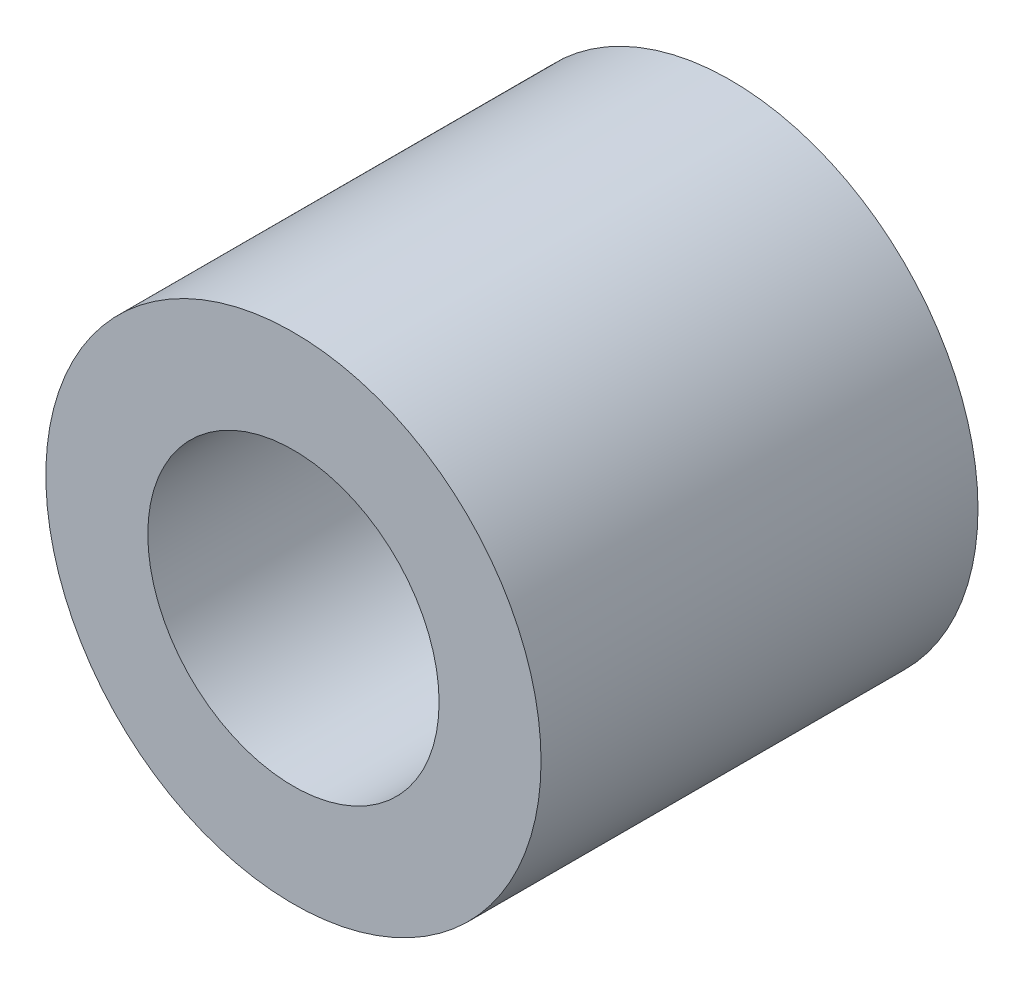
ISO-10303-21;
HEADER;
FILE_DESCRIPTION(('STEP AP214'),'2;1');
FILE_NAME('part.step','',(''),(''),'','','');
FILE_SCHEMA(('AUTOMOTIVE_DESIGN { 1 0 10303 214 1 1 1 1 }'));
ENDSEC;
DATA;
#1=APPLICATION_CONTEXT('core data for automotive mechanical design processes');
#2=APPLICATION_PROTOCOL_DEFINITION('international standard','automotive_design',2000,#1);
#3=PRODUCT_CONTEXT('',#1,'mechanical');
#4=PRODUCT('Part','Part','',(#3));
#5=PRODUCT_RELATED_PRODUCT_CATEGORY('part','',(#4));
#6=PRODUCT_DEFINITION_FORMATION('','',#4);
#7=PRODUCT_DEFINITION_CONTEXT('part definition',#1,'design');
#8=PRODUCT_DEFINITION('design','',#6,#7);
#9=PRODUCT_DEFINITION_SHAPE('','',#8);
#10=(LENGTH_UNIT() NAMED_UNIT(*) SI_UNIT(.MILLI.,.METRE.));
#11=(NAMED_UNIT(*) PLANE_ANGLE_UNIT() SI_UNIT($,.RADIAN.));
#12=(NAMED_UNIT(*) SI_UNIT($,.STERADIAN.) SOLID_ANGLE_UNIT());
#13=UNCERTAINTY_MEASURE_WITH_UNIT(LENGTH_MEASURE(1.E-05),#10,'distance_accuracy_value','');
#14=(GEOMETRIC_REPRESENTATION_CONTEXT(3) GLOBAL_UNCERTAINTY_ASSIGNED_CONTEXT((#13)) GLOBAL_UNIT_ASSIGNED_CONTEXT((#10,
#11,#12)) REPRESENTATION_CONTEXT('',''));
#15=CARTESIAN_POINT('',(0.,0.,0.));
#16=DIRECTION('',(0.,0.,1.));
#17=DIRECTION('',(1.,0.,0.));
#18=AXIS2_PLACEMENT_3D('',#15,#16,#17);
#19=CARTESIAN_POINT('',(0.,0.,7.5));
#20=DIRECTION('',(0.,0.,1.));
#21=DIRECTION('',(1.,0.,0.));
#22=AXIS2_PLACEMENT_3D('',#19,#20,#21);
#23=PLANE('',#22);
#24=CARTESIAN_POINT('',(0.,0.,7.5));
#25=DIRECTION('',(0.,0.,1.));
#26=DIRECTION('',(1.,0.,0.));
#27=AXIS2_PLACEMENT_3D('',#24,#25,#26);
#28=CIRCLE('',#27,8.5);
#29=CARTESIAN_POINT('',(8.5,0.,7.5));
#30=VERTEX_POINT('',#29);
#31=EDGE_CURVE('E10',#30,#30,#28,.T.);
#32=ORIENTED_EDGE('',*,*,#31,.T.);
#33=EDGE_LOOP('',(#32));
#34=FACE_BOUND('',#33,.T.);
#35=CARTESIAN_POINT('',(0.,0.,7.5));
#36=DIRECTION('',(0.,0.,1.));
#37=DIRECTION('',(1.,0.,0.));
#38=AXIS2_PLACEMENT_3D('',#35,#36,#37);
#39=CIRCLE('',#38,5.);
#40=CARTESIAN_POINT('',(5.,0.,7.5));
#41=VERTEX_POINT('',#40);
#42=EDGE_CURVE('E47',#41,#41,#39,.T.);
#43=ORIENTED_EDGE('',*,*,#42,.F.);
#44=EDGE_LOOP('',(#43));
#45=FACE_BOUND('',#44,.T.);
#46=ADVANCED_FACE('F36',(#34,#45),#23,.T.);
#47=CARTESIAN_POINT('',(0.,0.,-7.5));
#48=DIRECTION('',(0.,0.,1.));
#49=DIRECTION('',(1.,0.,0.));
#50=AXIS2_PLACEMENT_3D('',#47,#48,#49);
#51=PLANE('',#50);
#52=CARTESIAN_POINT('',(0.,0.,-7.5));
#53=DIRECTION('',(0.,0.,1.));
#54=DIRECTION('',(1.,0.,0.));
#55=AXIS2_PLACEMENT_3D('',#52,#53,#54);
#56=CIRCLE('',#55,8.5);
#57=CARTESIAN_POINT('',(8.5,0.,-7.5));
#58=VERTEX_POINT('',#57);
#59=EDGE_CURVE('E40',#58,#58,#56,.T.);
#60=ORIENTED_EDGE('',*,*,#59,.F.);
#61=EDGE_LOOP('',(#60));
#62=FACE_BOUND('',#61,.T.);
#63=CARTESIAN_POINT('',(0.,0.,-7.5));
#64=DIRECTION('',(0.,0.,1.));
#65=DIRECTION('',(1.,0.,0.));
#66=AXIS2_PLACEMENT_3D('',#63,#64,#65);
#67=CIRCLE('',#66,5.);
#68=CARTESIAN_POINT('',(5.,0.,-7.5));
#69=VERTEX_POINT('',#68);
#70=EDGE_CURVE('E49',#69,#69,#67,.T.);
#71=ORIENTED_EDGE('',*,*,#70,.T.);
#72=EDGE_LOOP('',(#71));
#73=FACE_BOUND('',#72,.T.);
#74=ADVANCED_FACE('F59',(#62,#73),#51,.F.);
#75=CARTESIAN_POINT('',(0.,0.,7.5));
#76=DIRECTION('',(0.,0.,-1.));
#77=DIRECTION('',(-1.,0.,0.));
#78=AXIS2_PLACEMENT_3D('',#75,#76,#77);
#79=CYLINDRICAL_SURFACE('',#78,8.5);
#80=ORIENTED_EDGE('',*,*,#31,.F.);
#81=EDGE_LOOP('',(#80));
#82=FACE_BOUND('',#81,.T.);
#83=ORIENTED_EDGE('',*,*,#59,.T.);
#84=EDGE_LOOP('',(#83));
#85=FACE_BOUND('',#84,.T.);
#86=ADVANCED_FACE('F38',(#82,#85),#79,.T.);
#87=CARTESIAN_POINT('',(0.,0.,7.5));
#88=DIRECTION('',(0.,0.,-1.));
#89=DIRECTION('',(-1.,0.,0.));
#90=AXIS2_PLACEMENT_3D('',#87,#88,#89);
#91=CYLINDRICAL_SURFACE('',#90,5.);
#92=ORIENTED_EDGE('',*,*,#42,.T.);
#93=EDGE_LOOP('',(#92));
#94=FACE_BOUND('',#93,.T.);
#95=ORIENTED_EDGE('',*,*,#70,.F.);
#96=EDGE_LOOP('',(#95));
#97=FACE_BOUND('',#96,.T.);
#98=ADVANCED_FACE('F55',(#94,#97),#91,.F.);
#99=CLOSED_SHELL('',(#46,#74,#86,#98));
#100=MANIFOLD_SOLID_BREP('B2',#99);
#101=ADVANCED_BREP_SHAPE_REPRESENTATION('',(#18,#100),#14);
#102=SHAPE_DEFINITION_REPRESENTATION(#9,#101);
ENDSEC;
END-ISO-10303-21;
